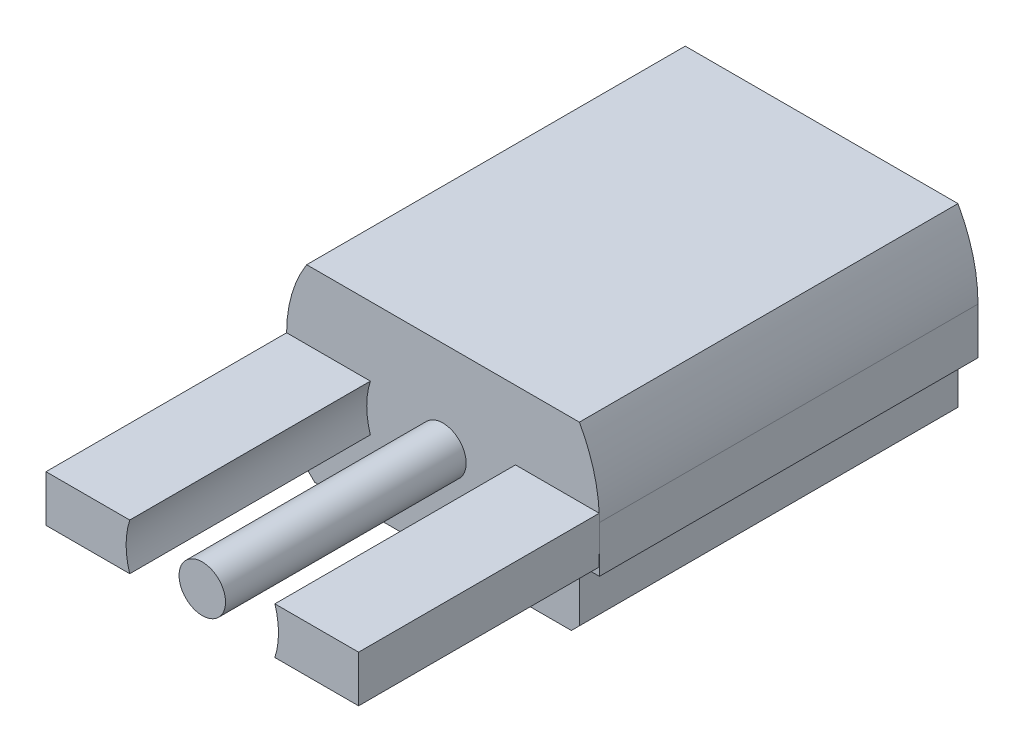
ISO-10303-21;
HEADER;
FILE_DESCRIPTION(('STEP AP214'),'2;1');
FILE_NAME('part.step','',(''),(''),'','','');
FILE_SCHEMA(('AUTOMOTIVE_DESIGN { 1 0 10303 214 1 1 1 1 }'));
ENDSEC;
DATA;
#1=APPLICATION_CONTEXT('core data for automotive mechanical design processes');
#2=APPLICATION_PROTOCOL_DEFINITION('international standard','automotive_design',2000,#1);
#3=PRODUCT_CONTEXT('',#1,'mechanical');
#4=PRODUCT('Part','Part','',(#3));
#5=PRODUCT_RELATED_PRODUCT_CATEGORY('part','',(#4));
#6=PRODUCT_DEFINITION_FORMATION('','',#4);
#7=PRODUCT_DEFINITION_CONTEXT('part definition',#1,'design');
#8=PRODUCT_DEFINITION('design','',#6,#7);
#9=PRODUCT_DEFINITION_SHAPE('','',#8);
#10=(LENGTH_UNIT() NAMED_UNIT(*) SI_UNIT(.MILLI.,.METRE.));
#11=(NAMED_UNIT(*) PLANE_ANGLE_UNIT() SI_UNIT($,.RADIAN.));
#12=(NAMED_UNIT(*) SI_UNIT($,.STERADIAN.) SOLID_ANGLE_UNIT());
#13=UNCERTAINTY_MEASURE_WITH_UNIT(LENGTH_MEASURE(1.E-05),#10,'distance_accuracy_value','');
#14=(GEOMETRIC_REPRESENTATION_CONTEXT(3) GLOBAL_UNCERTAINTY_ASSIGNED_CONTEXT((#13)) GLOBAL_UNIT_ASSIGNED_CONTEXT((#10,
#11,#12)) REPRESENTATION_CONTEXT('',''));
#15=CARTESIAN_POINT('',(0.,0.,0.));
#16=DIRECTION('',(0.,0.,1.));
#17=DIRECTION('',(1.,0.,0.));
#18=AXIS2_PLACEMENT_3D('',#15,#16,#17);
#19=CARTESIAN_POINT('',(-0.25,1.44,4.72));
#20=DIRECTION('',(0.,1.,0.));
#21=DIRECTION('',(-1.,0.,0.));
#22=AXIS2_PLACEMENT_3D('',#19,#20,#21);
#23=PLANE('',#22);
#24=DIRECTION('',(0.,0.,1.));
#25=VECTOR('',#24,1.);
#26=CARTESIAN_POINT('',(-0.25,1.44,0.));
#27=LINE('',#26,#25);
#28=CARTESIAN_POINT('',(-0.25,1.44,7.72));
#29=VERTEX_POINT('',#28);
#30=CARTESIAN_POINT('',(-0.25,1.44,4.72));
#31=VERTEX_POINT('',#30);
#32=EDGE_CURVE('E277',#29,#31,#27,.F.);
#33=ORIENTED_EDGE('',*,*,#32,.F.);
#34=DIRECTION('',(1.,0.,0.));
#35=VECTOR('',#34,1.);
#36=CARTESIAN_POINT('',(1.69872085735134,1.44,7.72));
#37=LINE('',#36,#35);
#38=CARTESIAN_POINT('',(0.794066227119449,1.44,7.72));
#39=VERTEX_POINT('',#38);
#40=EDGE_CURVE('E155',#39,#29,#37,.F.);
#41=ORIENTED_EDGE('',*,*,#40,.F.);
#42=DIRECTION('',(0.,0.,-1.));
#43=VECTOR('',#42,1.);
#44=CARTESIAN_POINT('',(0.794066227119449,1.44,7.72));
#45=LINE('',#44,#43);
#46=CARTESIAN_POINT('',(0.794066227119449,1.44,4.72));
#47=VERTEX_POINT('',#46);
#48=EDGE_CURVE('E136',#39,#47,#45,.T.);
#49=ORIENTED_EDGE('',*,*,#48,.T.);
#50=DIRECTION('',(-1.,0.,0.));
#51=VECTOR('',#50,1.);
#52=CARTESIAN_POINT('',(-0.25,1.44,4.72));
#53=LINE('',#52,#51);
#54=EDGE_CURVE('E20',#47,#31,#53,.T.);
#55=ORIENTED_EDGE('',*,*,#54,.T.);
#56=EDGE_LOOP('',(#33,#41,#49,#55));
#57=FACE_BOUND('',#56,.T.);
#58=ADVANCED_FACE('F16',(#57),#23,.T.);
#59=CARTESIAN_POINT('',(3.64744171470268,1.44,4.72));
#60=DIRECTION('',(1.,0.,0.));
#61=DIRECTION('',(0.,1.,0.));
#62=AXIS2_PLACEMENT_3D('',#59,#60,#61);
#63=PLANE('',#62);
#64=DIRECTION('',(0.,1.,0.));
#65=VECTOR('',#64,1.);
#66=CARTESIAN_POINT('',(3.64744171470268,1.44,4.72));
#67=LINE('',#66,#65);
#68=CARTESIAN_POINT('',(3.64744171470268,0.86,4.72));
#69=VERTEX_POINT('',#68);
#70=CARTESIAN_POINT('',(3.64872085735134,1.33964643827846,4.72));
#71=VERTEX_POINT('',#70);
#72=EDGE_CURVE('E152',#69,#71,#67,.T.);
#73=ORIENTED_EDGE('',*,*,#72,.T.);
#74=CARTESIAN_POINT('',(1.68044207297751,1.33964643827846,4.72));
#75=DIRECTION('',(0.,0.,-1.));
#76=DIRECTION('',(0.998701086542201,0.0509523281060592,0.));
#77=AXIS2_PLACEMENT_3D('',#74,#75,#76);
#78=CIRCLE('',#77,1.96955792702249);
#79=CARTESIAN_POINT('',(3.64744171470268,1.44,4.72));
#80=VERTEX_POINT('',#79);
#81=EDGE_CURVE('E169',#80,#71,#78,.T.);
#82=ORIENTED_EDGE('',*,*,#81,.F.);
#83=DIRECTION('',(0.,0.,1.));
#84=VECTOR('',#83,1.);
#85=CARTESIAN_POINT('',(3.64744171470268,1.44,4.72));
#86=LINE('',#85,#84);
#87=CARTESIAN_POINT('',(3.64744171470268,1.44,7.72));
#88=VERTEX_POINT('',#87);
#89=EDGE_CURVE('E283',#88,#80,#86,.F.);
#90=ORIENTED_EDGE('',*,*,#89,.F.);
#91=DIRECTION('',(0.,-1.,0.));
#92=VECTOR('',#91,1.);
#93=CARTESIAN_POINT('',(3.64744171470268,1.15,7.72));
#94=LINE('',#93,#92);
#95=CARTESIAN_POINT('',(3.64744171470268,0.86,7.72));
#96=VERTEX_POINT('',#95);
#97=EDGE_CURVE('E289',#96,#88,#94,.F.);
#98=ORIENTED_EDGE('',*,*,#97,.F.);
#99=DIRECTION('',(0.,0.,-1.));
#100=VECTOR('',#99,1.);
#101=CARTESIAN_POINT('',(3.64744171470268,0.86,0.));
#102=LINE('',#101,#100);
#103=EDGE_CURVE('E296',#69,#96,#102,.F.);
#104=ORIENTED_EDGE('',*,*,#103,.F.);
#105=EDGE_LOOP('',(#73,#82,#90,#98,#104));
#106=FACE_BOUND('',#105,.T.);
#107=ADVANCED_FACE('F176',(#106),#63,.T.);
#108=CARTESIAN_POINT('',(3.65,1.33964643827846,0.));
#109=DIRECTION('',(1.,0.,0.));
#110=DIRECTION('',(0.,0.,-1.));
#111=AXIS2_PLACEMENT_3D('',#108,#109,#110);
#112=PLANE('',#111);
#113=DIRECTION('',(0.,1.,0.));
#114=VECTOR('',#113,1.);
#115=CARTESIAN_POINT('',(3.65,1.33964643827846,0.));
#116=LINE('',#115,#114);
#117=CARTESIAN_POINT('',(3.65,0.759646438278462,0.));
#118=VERTEX_POINT('',#117);
#119=CARTESIAN_POINT('',(3.65,1.33964643827846,0.));
#120=VERTEX_POINT('',#119);
#121=EDGE_CURVE('E141',#118,#120,#116,.T.);
#122=ORIENTED_EDGE('',*,*,#121,.T.);
#123=DIRECTION('',(0.,0.,1.));
#124=VECTOR('',#123,1.);
#125=CARTESIAN_POINT('',(3.65,1.33964643827846,0.));
#126=LINE('',#125,#124);
#127=EDGE_CURVE('E343',#71,#120,#126,.F.);
#128=ORIENTED_EDGE('',*,*,#127,.F.);
#129=DIRECTION('',(0.,1.,0.));
#130=VECTOR('',#129,1.);
#131=CARTESIAN_POINT('',(3.65,1.33964643827846,4.72));
#132=LINE('',#131,#130);
#133=CARTESIAN_POINT('',(3.65,0.759646438278462,4.72));
#134=VERTEX_POINT('',#133);
#135=EDGE_CURVE('E348',#71,#134,#132,.F.);
#136=ORIENTED_EDGE('',*,*,#135,.T.);
#137=DIRECTION('',(0.,0.,-1.));
#138=VECTOR('',#137,1.);
#139=CARTESIAN_POINT('',(3.65,0.759646438278462,0.));
#140=LINE('',#139,#138);
#141=EDGE_CURVE('E293',#118,#134,#140,.F.);
#142=ORIENTED_EDGE('',*,*,#141,.F.);
#143=EDGE_LOOP('',(#122,#128,#136,#142));
#144=FACE_BOUND('',#143,.T.);
#145=ADVANCED_FACE('F185',(#144),#112,.T.);
#146=CARTESIAN_POINT('',(1.69872085735134,1.15,7.72));
#147=DIRECTION('',(0.,0.,-1.));
#148=DIRECTION('',(-1.,0.,0.));
#149=AXIS2_PLACEMENT_3D('',#146,#147,#148);
#150=CYLINDRICAL_SURFACE('',#149,0.95);
#151=CARTESIAN_POINT('',(1.69872085735134,1.15,7.72));
#152=DIRECTION('',(0.,0.,-1.));
#153=DIRECTION('',(-1.,0.,0.));
#154=AXIS2_PLACEMENT_3D('',#151,#152,#153);
#155=CIRCLE('',#154,0.95);
#156=CARTESIAN_POINT('',(0.794066227119448,0.86,7.72));
#157=VERTEX_POINT('',#156);
#158=EDGE_CURVE('E156',#157,#39,#155,.T.);
#159=ORIENTED_EDGE('',*,*,#158,.F.);
#160=DIRECTION('',(0.,0.,-1.));
#161=VECTOR('',#160,1.);
#162=CARTESIAN_POINT('',(0.794066227119447,0.86,0.));
#163=LINE('',#162,#161);
#164=CARTESIAN_POINT('',(0.794066227119448,0.86,4.72));
#165=VERTEX_POINT('',#164);
#166=EDGE_CURVE('E138',#165,#157,#163,.F.);
#167=ORIENTED_EDGE('',*,*,#166,.F.);
#168=CARTESIAN_POINT('',(1.69872085735134,1.15,4.72));
#169=DIRECTION('',(0.,0.,-1.));
#170=DIRECTION('',(-1.,0.,0.));
#171=AXIS2_PLACEMENT_3D('',#168,#169,#170);
#172=CIRCLE('',#171,0.95);
#173=EDGE_CURVE('E131',#47,#165,#172,.F.);
#174=ORIENTED_EDGE('',*,*,#173,.F.);
#175=ORIENTED_EDGE('',*,*,#48,.F.);
#176=EDGE_LOOP('',(#159,#167,#174,#175));
#177=FACE_BOUND('',#176,.T.);
#178=ADVANCED_FACE('F134',(#177),#150,.F.);
#179=CARTESIAN_POINT('',(1.69872085735134,1.15,7.72));
#180=DIRECTION('',(0.,0.,1.));
#181=DIRECTION('',(0.,-1.,0.));
#182=AXIS2_PLACEMENT_3D('',#179,#180,#181);
#183=PLANE('',#182);
#184=DIRECTION('',(0.,-1.,0.));
#185=VECTOR('',#184,1.);
#186=CARTESIAN_POINT('',(-0.25,0.86,7.72));
#187=LINE('',#186,#185);
#188=CARTESIAN_POINT('',(-0.25,0.86,7.72));
#189=VERTEX_POINT('',#188);
#190=EDGE_CURVE('E280',#189,#29,#187,.F.);
#191=ORIENTED_EDGE('',*,*,#190,.F.);
#192=DIRECTION('',(1.,0.,0.));
#193=VECTOR('',#192,1.);
#194=CARTESIAN_POINT('',(0.,0.86,7.72));
#195=LINE('',#194,#193);
#196=EDGE_CURVE('E319',#157,#189,#195,.F.);
#197=ORIENTED_EDGE('',*,*,#196,.F.);
#198=ORIENTED_EDGE('',*,*,#158,.T.);
#199=ORIENTED_EDGE('',*,*,#40,.T.);
#200=EDGE_LOOP('',(#191,#197,#198,#199));
#201=FACE_BOUND('',#200,.T.);
#202=ADVANCED_FACE('F474',(#201),#183,.T.);
#203=CARTESIAN_POINT('',(-0.25,0.86,0.));
#204=DIRECTION('',(-1.,0.,0.));
#205=DIRECTION('',(0.,-1.,0.));
#206=AXIS2_PLACEMENT_3D('',#203,#204,#205);
#207=PLANE('',#206);
#208=ORIENTED_EDGE('',*,*,#190,.T.);
#209=ORIENTED_EDGE('',*,*,#32,.T.);
#210=DIRECTION('',(0.,0.,1.));
#211=VECTOR('',#210,1.);
#212=CARTESIAN_POINT('',(-0.25,1.44,0.));
#213=LINE('',#212,#211);
#214=CARTESIAN_POINT('',(-0.25,1.44,0.));
#215=VERTEX_POINT('',#214);
#216=EDGE_CURVE('E267',#215,#31,#213,.T.);
#217=ORIENTED_EDGE('',*,*,#216,.F.);
#218=DIRECTION('',(0.,-1.,0.));
#219=VECTOR('',#218,1.);
#220=CARTESIAN_POINT('',(-0.25,0.86,0.));
#221=LINE('',#220,#219);
#222=CARTESIAN_POINT('',(-0.25,0.86,0.));
#223=VERTEX_POINT('',#222);
#224=EDGE_CURVE('E327',#215,#223,#221,.T.);
#225=ORIENTED_EDGE('',*,*,#224,.T.);
#226=DIRECTION('',(0.,0.,-1.));
#227=VECTOR('',#226,1.);
#228=CARTESIAN_POINT('',(-0.25,0.86,0.));
#229=LINE('',#228,#227);
#230=EDGE_CURVE('E321',#189,#223,#229,.T.);
#231=ORIENTED_EDGE('',*,*,#230,.F.);
#232=EDGE_LOOP('',(#208,#209,#217,#225,#231));
#233=FACE_BOUND('',#232,.T.);
#234=ADVANCED_FACE('F478',(#233),#207,.T.);
#235=CARTESIAN_POINT('',(3.65,0.759646438278462,0.));
#236=DIRECTION('',(0.,-1.,0.));
#237=DIRECTION('',(0.,0.,-1.));
#238=AXIS2_PLACEMENT_3D('',#235,#236,#237);
#239=PLANE('',#238);
#240=DIRECTION('',(1.,0.,0.));
#241=VECTOR('',#240,1.);
#242=CARTESIAN_POINT('',(3.65,0.759646438278462,0.));
#243=LINE('',#242,#241);
#244=CARTESIAN_POINT('',(3.4,0.759646438278462,0.));
#245=VERTEX_POINT('',#244);
#246=EDGE_CURVE('E302',#245,#118,#243,.T.);
#247=ORIENTED_EDGE('',*,*,#246,.T.);
#248=ORIENTED_EDGE('',*,*,#141,.T.);
#249=DIRECTION('',(1.,0.,0.));
#250=VECTOR('',#249,1.);
#251=CARTESIAN_POINT('',(3.65,0.759646438278462,4.72));
#252=LINE('',#251,#250);
#253=CARTESIAN_POINT('',(3.4,0.759646438278462,4.72));
#254=VERTEX_POINT('',#253);
#255=EDGE_CURVE('E279',#134,#254,#252,.F.);
#256=ORIENTED_EDGE('',*,*,#255,.T.);
#257=DIRECTION('',(0.,0.,-1.));
#258=VECTOR('',#257,1.);
#259=CARTESIAN_POINT('',(3.4,0.759646438278462,0.));
#260=LINE('',#259,#258);
#261=EDGE_CURVE('E372',#245,#254,#260,.F.);
#262=ORIENTED_EDGE('',*,*,#261,.F.);
#263=EDGE_LOOP('',(#247,#248,#256,#262));
#264=FACE_BOUND('',#263,.T.);
#265=ADVANCED_FACE('F613',(#264),#239,.T.);
#266=CARTESIAN_POINT('',(1.69872085735134,1.15,7.72));
#267=DIRECTION('',(0.,0.,-1.));
#268=DIRECTION('',(-1.,0.,0.));
#269=AXIS2_PLACEMENT_3D('',#266,#267,#268);
#270=PLANE('',#269);
#271=CARTESIAN_POINT('',(1.69872085735134,1.15,7.72));
#272=DIRECTION('',(0.,0.,1.));
#273=DIRECTION('',(1.,0.,0.));
#274=AXIS2_PLACEMENT_3D('',#271,#272,#273);
#275=CIRCLE('',#274,0.29);
#276=CARTESIAN_POINT('',(1.98872085735134,1.15,7.72));
#277=VERTEX_POINT('',#276);
#278=EDGE_CURVE('E375',#277,#277,#275,.F.);
#279=ORIENTED_EDGE('',*,*,#278,.F.);
#280=EDGE_LOOP('',(#279));
#281=FACE_BOUND('',#280,.T.);
#282=ADVANCED_FACE('F616',(#281),#270,.F.);
#283=CARTESIAN_POINT('',(1.69872085735134,1.15,7.72));
#284=DIRECTION('',(0.,0.,1.));
#285=DIRECTION('',(0.,-1.,0.));
#286=AXIS2_PLACEMENT_3D('',#283,#284,#285);
#287=PLANE('',#286);
#288=ORIENTED_EDGE('',*,*,#97,.T.);
#289=DIRECTION('',(-1.,0.,0.));
#290=VECTOR('',#289,1.);
#291=CARTESIAN_POINT('',(-0.25,1.44,7.72));
#292=LINE('',#291,#290);
#293=CARTESIAN_POINT('',(2.60337548758323,1.44,7.72));
#294=VERTEX_POINT('',#293);
#295=EDGE_CURVE('E286',#294,#88,#292,.F.);
#296=ORIENTED_EDGE('',*,*,#295,.F.);
#297=CARTESIAN_POINT('',(1.69872085735134,1.15,7.72));
#298=DIRECTION('',(0.,0.,-1.));
#299=DIRECTION('',(-1.,0.,0.));
#300=AXIS2_PLACEMENT_3D('',#297,#298,#299);
#301=CIRCLE('',#300,0.95);
#302=CARTESIAN_POINT('',(2.60337548758323,0.86,7.72));
#303=VERTEX_POINT('',#302);
#304=EDGE_CURVE('E228',#294,#303,#301,.T.);
#305=ORIENTED_EDGE('',*,*,#304,.T.);
#306=DIRECTION('',(1.,0.,0.));
#307=VECTOR('',#306,1.);
#308=CARTESIAN_POINT('',(0.,0.86,7.72));
#309=LINE('',#308,#307);
#310=EDGE_CURVE('E299',#96,#303,#309,.F.);
#311=ORIENTED_EDGE('',*,*,#310,.F.);
#312=EDGE_LOOP('',(#288,#296,#305,#311));
#313=FACE_BOUND('',#312,.T.);
#314=ADVANCED_FACE('F461',(#313),#287,.T.);
#315=CARTESIAN_POINT('',(0.,0.86,0.));
#316=DIRECTION('',(0.,-1.,0.));
#317=DIRECTION('',(0.,0.,-1.));
#318=AXIS2_PLACEMENT_3D('',#315,#316,#317);
#319=PLANE('',#318);
#320=ORIENTED_EDGE('',*,*,#103,.T.);
#321=ORIENTED_EDGE('',*,*,#310,.T.);
#322=DIRECTION('',(0.,0.,-1.));
#323=VECTOR('',#322,1.);
#324=CARTESIAN_POINT('',(2.60337548758323,0.86,7.72));
#325=LINE('',#324,#323);
#326=CARTESIAN_POINT('',(2.60337548758323,0.86,4.72));
#327=VERTEX_POINT('',#326);
#328=EDGE_CURVE('E380',#303,#327,#325,.T.);
#329=ORIENTED_EDGE('',*,*,#328,.T.);
#330=DIRECTION('',(1.,0.,0.));
#331=VECTOR('',#330,1.);
#332=CARTESIAN_POINT('',(0.,0.86,4.72));
#333=LINE('',#332,#331);
#334=EDGE_CURVE('E292',#327,#69,#333,.T.);
#335=ORIENTED_EDGE('',*,*,#334,.T.);
#336=EDGE_LOOP('',(#320,#321,#329,#335));
#337=FACE_BOUND('',#336,.T.);
#338=ADVANCED_FACE('F622',(#337),#319,.T.);
#339=CARTESIAN_POINT('',(-0.25,1.44,4.72));
#340=DIRECTION('',(0.,1.,0.));
#341=DIRECTION('',(-1.,0.,0.));
#342=AXIS2_PLACEMENT_3D('',#339,#340,#341);
#343=PLANE('',#342);
#344=ORIENTED_EDGE('',*,*,#89,.T.);
#345=DIRECTION('',(-1.,0.,0.));
#346=VECTOR('',#345,1.);
#347=CARTESIAN_POINT('',(-0.25,1.44,4.72));
#348=LINE('',#347,#346);
#349=CARTESIAN_POINT('',(2.60337548758323,1.44,4.72));
#350=VERTEX_POINT('',#349);
#351=EDGE_CURVE('E285',#80,#350,#348,.T.);
#352=ORIENTED_EDGE('',*,*,#351,.T.);
#353=DIRECTION('',(0.,0.,-1.));
#354=VECTOR('',#353,1.);
#355=CARTESIAN_POINT('',(2.60337548758323,1.44,7.72));
#356=LINE('',#355,#354);
#357=EDGE_CURVE('E225',#350,#294,#356,.F.);
#358=ORIENTED_EDGE('',*,*,#357,.T.);
#359=ORIENTED_EDGE('',*,*,#295,.T.);
#360=EDGE_LOOP('',(#344,#352,#358,#359));
#361=FACE_BOUND('',#360,.T.);
#362=ADVANCED_FACE('F456',(#361),#343,.T.);
#363=CARTESIAN_POINT('',(1.3542,1.44,0.));
#364=DIRECTION('',(0.,0.,1.));
#365=DIRECTION('',(1.,0.,0.));
#366=AXIS2_PLACEMENT_3D('',#363,#364,#365);
#367=CYLINDRICAL_SURFACE('',#366,1.6042);
#368=CARTESIAN_POINT('',(1.3542,1.44,0.));
#369=DIRECTION('',(0.,0.,1.));
#370=DIRECTION('',(1.,0.,0.));
#371=AXIS2_PLACEMENT_3D('',#368,#369,#370);
#372=CIRCLE('',#371,1.6042);
#373=CARTESIAN_POINT('',(0.,2.3,0.));
#374=VERTEX_POINT('',#373);
#375=EDGE_CURVE('E276',#374,#215,#372,.T.);
#376=ORIENTED_EDGE('',*,*,#375,.T.);
#377=ORIENTED_EDGE('',*,*,#216,.T.);
#378=CARTESIAN_POINT('',(1.3542,1.44,4.72));
#379=DIRECTION('',(0.,0.,1.));
#380=DIRECTION('',(1.,0.,0.));
#381=AXIS2_PLACEMENT_3D('',#378,#379,#380);
#382=CIRCLE('',#381,1.6042);
#383=CARTESIAN_POINT('',(0.,2.3,4.72));
#384=VERTEX_POINT('',#383);
#385=EDGE_CURVE('E148',#31,#384,#382,.F.);
#386=ORIENTED_EDGE('',*,*,#385,.T.);
#387=DIRECTION('',(0.,0.,1.));
#388=VECTOR('',#387,1.);
#389=CARTESIAN_POINT('',(0.,2.3,0.));
#390=LINE('',#389,#388);
#391=EDGE_CURVE('E400',#374,#384,#390,.T.);
#392=ORIENTED_EDGE('',*,*,#391,.F.);
#393=EDGE_LOOP('',(#376,#377,#386,#392));
#394=FACE_BOUND('',#393,.T.);
#395=ADVANCED_FACE('F258',(#394),#367,.T.);
#396=CARTESIAN_POINT('',(1.68044207297751,1.33964643827846,0.));
#397=DIRECTION('',(0.,0.,1.));
#398=DIRECTION('',(1.,0.,0.));
#399=AXIS2_PLACEMENT_3D('',#396,#397,#398);
#400=CYLINDRICAL_SURFACE('',#399,1.96955792702249);
#401=CARTESIAN_POINT('',(1.68044207297751,1.33964643827846,0.));
#402=DIRECTION('',(0.,0.,1.));
#403=DIRECTION('',(1.,0.,0.));
#404=AXIS2_PLACEMENT_3D('',#401,#402,#403);
#405=CIRCLE('',#404,1.96955792702249);
#406=CARTESIAN_POINT('',(3.4,2.3,0.));
#407=VERTEX_POINT('',#406);
#408=EDGE_CURVE('E320',#120,#407,#405,.T.);
#409=ORIENTED_EDGE('',*,*,#408,.T.);
#410=DIRECTION('',(0.,0.,1.));
#411=VECTOR('',#410,1.);
#412=CARTESIAN_POINT('',(3.4,2.3,0.));
#413=LINE('',#412,#411);
#414=CARTESIAN_POINT('',(3.4,2.3,4.72));
#415=VERTEX_POINT('',#414);
#416=EDGE_CURVE('E398',#415,#407,#413,.F.);
#417=ORIENTED_EDGE('',*,*,#416,.F.);
#418=CARTESIAN_POINT('',(1.68044207297751,1.33964643827846,4.72));
#419=DIRECTION('',(0.,0.,1.));
#420=DIRECTION('',(1.,0.,0.));
#421=AXIS2_PLACEMENT_3D('',#418,#419,#420);
#422=CIRCLE('',#421,1.96955792702249);
#423=EDGE_CURVE('E275',#415,#80,#422,.F.);
#424=ORIENTED_EDGE('',*,*,#423,.T.);
#425=ORIENTED_EDGE('',*,*,#81,.T.);
#426=ORIENTED_EDGE('',*,*,#127,.T.);
#427=EDGE_LOOP('',(#409,#417,#424,#425,#426));
#428=FACE_BOUND('',#427,.T.);
#429=ADVANCED_FACE('F253',(#428),#400,.T.);
#430=CARTESIAN_POINT('',(0.,0.86,0.));
#431=DIRECTION('',(0.,-1.,0.));
#432=DIRECTION('',(0.,0.,-1.));
#433=AXIS2_PLACEMENT_3D('',#430,#431,#432);
#434=PLANE('',#433);
#435=DIRECTION('',(0.,0.,1.));
#436=VECTOR('',#435,1.);
#437=CARTESIAN_POINT('',(0.,0.86,0.));
#438=LINE('',#437,#436);
#439=CARTESIAN_POINT('',(0.,0.86,4.72));
#440=VERTEX_POINT('',#439);
#441=CARTESIAN_POINT('',(0.,0.86,0.));
#442=VERTEX_POINT('',#441);
#443=EDGE_CURVE('E397',#440,#442,#438,.F.);
#444=ORIENTED_EDGE('',*,*,#443,.F.);
#445=DIRECTION('',(1.,0.,0.));
#446=VECTOR('',#445,1.);
#447=CARTESIAN_POINT('',(0.,0.86,4.72));
#448=LINE('',#447,#446);
#449=EDGE_CURVE('E370',#440,#165,#448,.T.);
#450=ORIENTED_EDGE('',*,*,#449,.T.);
#451=ORIENTED_EDGE('',*,*,#166,.T.);
#452=ORIENTED_EDGE('',*,*,#196,.T.);
#453=ORIENTED_EDGE('',*,*,#230,.T.);
#454=DIRECTION('',(1.,0.,0.));
#455=VECTOR('',#454,1.);
#456=CARTESIAN_POINT('',(0.,0.86,0.));
#457=LINE('',#456,#455);
#458=EDGE_CURVE('E324',#223,#442,#457,.T.);
#459=ORIENTED_EDGE('',*,*,#458,.T.);
#460=EDGE_LOOP('',(#444,#450,#451,#452,#453,#459));
#461=FACE_BOUND('',#460,.T.);
#462=ADVANCED_FACE('F249',(#461),#434,.T.);
#463=CARTESIAN_POINT('',(3.4,0.759646438278462,0.));
#464=DIRECTION('',(1.,0.,0.));
#465=DIRECTION('',(0.,0.,-1.));
#466=AXIS2_PLACEMENT_3D('',#463,#464,#465);
#467=PLANE('',#466);
#468=DIRECTION('',(0.,0.,1.));
#469=VECTOR('',#468,1.);
#470=CARTESIAN_POINT('',(3.4,0.1,0.));
#471=LINE('',#470,#469);
#472=CARTESIAN_POINT('',(3.4,0.1,0.));
#473=VERTEX_POINT('',#472);
#474=CARTESIAN_POINT('',(3.4,0.1,4.72));
#475=VERTEX_POINT('',#474);
#476=EDGE_CURVE('E430',#473,#475,#471,.T.);
#477=ORIENTED_EDGE('',*,*,#476,.F.);
#478=DIRECTION('',(0.,1.,0.));
#479=VECTOR('',#478,1.);
#480=CARTESIAN_POINT('',(3.4,0.759646438278462,0.));
#481=LINE('',#480,#479);
#482=EDGE_CURVE('E374',#473,#245,#481,.T.);
#483=ORIENTED_EDGE('',*,*,#482,.T.);
#484=ORIENTED_EDGE('',*,*,#261,.T.);
#485=DIRECTION('',(0.,1.,0.));
#486=VECTOR('',#485,1.);
#487=CARTESIAN_POINT('',(3.4,0.759646438278462,4.72));
#488=LINE('',#487,#486);
#489=EDGE_CURVE('E373',#254,#475,#488,.F.);
#490=ORIENTED_EDGE('',*,*,#489,.T.);
#491=EDGE_LOOP('',(#477,#483,#484,#490));
#492=FACE_BOUND('',#491,.T.);
#493=ADVANCED_FACE('F245',(#492),#467,.T.);
#494=CARTESIAN_POINT('',(1.69872085735134,1.15,4.72));
#495=DIRECTION('',(0.,0.,1.));
#496=DIRECTION('',(1.,0.,0.));
#497=AXIS2_PLACEMENT_3D('',#494,#495,#496);
#498=CYLINDRICAL_SURFACE('',#497,0.29);
#499=CARTESIAN_POINT('',(1.69872085735134,1.15,4.72));
#500=DIRECTION('',(0.,0.,1.));
#501=DIRECTION('',(1.,0.,0.));
#502=AXIS2_PLACEMENT_3D('',#499,#500,#501);
#503=CIRCLE('',#502,0.29);
#504=CARTESIAN_POINT('',(1.98872085735134,1.15,4.72));
#505=VERTEX_POINT('',#504);
#506=EDGE_CURVE('E226',#505,#505,#503,.F.);
#507=ORIENTED_EDGE('',*,*,#506,.F.);
#508=EDGE_LOOP('',(#507));
#509=FACE_BOUND('',#508,.T.);
#510=ORIENTED_EDGE('',*,*,#278,.T.);
#511=EDGE_LOOP('',(#510));
#512=FACE_BOUND('',#511,.T.);
#513=ADVANCED_FACE('F241',(#509,#512),#498,.T.);
#514=CARTESIAN_POINT('',(1.69872085735134,1.15,7.72));
#515=DIRECTION('',(0.,0.,-1.));
#516=DIRECTION('',(-1.,0.,0.));
#517=AXIS2_PLACEMENT_3D('',#514,#515,#516);
#518=CYLINDRICAL_SURFACE('',#517,0.95);
#519=CARTESIAN_POINT('',(1.69872085735134,1.15,4.72));
#520=DIRECTION('',(0.,0.,-1.));
#521=DIRECTION('',(-1.,0.,0.));
#522=AXIS2_PLACEMENT_3D('',#519,#520,#521);
#523=CIRCLE('',#522,0.95);
#524=EDGE_CURVE('E425',#327,#350,#523,.F.);
#525=ORIENTED_EDGE('',*,*,#524,.F.);
#526=ORIENTED_EDGE('',*,*,#328,.F.);
#527=ORIENTED_EDGE('',*,*,#304,.F.);
#528=ORIENTED_EDGE('',*,*,#357,.F.);
#529=EDGE_LOOP('',(#525,#526,#527,#528));
#530=FACE_BOUND('',#529,.T.);
#531=ADVANCED_FACE('F236',(#530),#518,.F.);
#532=CARTESIAN_POINT('',(0.,2.3,0.));
#533=DIRECTION('',(0.,1.,0.));
#534=DIRECTION('',(0.,0.,1.));
#535=AXIS2_PLACEMENT_3D('',#532,#533,#534);
#536=PLANE('',#535);
#537=ORIENTED_EDGE('',*,*,#416,.T.);
#538=DIRECTION('',(1.,0.,0.));
#539=VECTOR('',#538,1.);
#540=CARTESIAN_POINT('',(0.,2.3,0.));
#541=LINE('',#540,#539);
#542=CARTESIAN_POINT('',(1.72046800371794,2.3,0.));
#543=VERTEX_POINT('',#542);
#544=EDGE_CURVE('E395',#407,#543,#541,.F.);
#545=ORIENTED_EDGE('',*,*,#544,.T.);
#546=CARTESIAN_POINT('',(1.72046800217332,2.29999999999966,2.73487765676882E-11));
#547=CARTESIAN_POINT('',(1.71364533478221,2.29999999999983,0.000121422039165599));
#548=CARTESIAN_POINT('',(1.70682266739111,2.29999999999994,0.000182133045085545));
#549=CARTESIAN_POINT('',(1.69317733260889,2.30000000000006,0.000182133045131684));
#550=CARTESIAN_POINT('',(1.68635466521779,2.30000000000006,0.000121422039257882));
#551=CARTESIAN_POINT('',(1.67953199782668,2.3,2.74872088262984E-11));
#552=B_SPLINE_CURVE_WITH_KNOTS('',3,(#546,#547,#548,#549,#550,#551),.UNSPECIFIED.,.F.,.F.,(4,2,
4),(0.,0.0204688125059364,0.0409376250118718),.UNSPECIFIED.);
#553=CARTESIAN_POINT('',(1.67953199705436,2.3,1.37435639913866E-11));
#554=VERTEX_POINT('',#553);
#555=EDGE_CURVE('E216',#543,#554,#552,.T.);
#556=ORIENTED_EDGE('',*,*,#555,.T.);
#557=DIRECTION('',(1.,0.,0.));
#558=VECTOR('',#557,1.);
#559=CARTESIAN_POINT('',(0.,2.3,0.));
#560=LINE('',#559,#558);
#561=EDGE_CURVE('E224',#554,#374,#560,.F.);
#562=ORIENTED_EDGE('',*,*,#561,.T.);
#563=ORIENTED_EDGE('',*,*,#391,.T.);
#564=DIRECTION('',(1.,0.,0.));
#565=VECTOR('',#564,1.);
#566=CARTESIAN_POINT('',(3.525,2.3,4.72));
#567=LINE('',#566,#565);
#568=EDGE_CURVE('E422',#415,#384,#567,.F.);
#569=ORIENTED_EDGE('',*,*,#568,.F.);
#570=EDGE_LOOP('',(#537,#545,#556,#562,#563,#569));
#571=FACE_BOUND('',#570,.T.);
#572=ADVANCED_FACE('F230',(#571),#536,.T.);
#573=CARTESIAN_POINT('',(0.,0.86,0.));
#574=DIRECTION('',(-1.,0.,0.));
#575=DIRECTION('',(0.,0.,1.));
#576=AXIS2_PLACEMENT_3D('',#573,#574,#575);
#577=PLANE('',#576);
#578=DIRECTION('',(0.,0.,1.));
#579=VECTOR('',#578,1.);
#580=CARTESIAN_POINT('',(0.,0.1,0.));
#581=LINE('',#580,#579);
#582=CARTESIAN_POINT('',(0.,0.1,4.72));
#583=VERTEX_POINT('',#582);
#584=CARTESIAN_POINT('',(0.,0.1,0.));
#585=VERTEX_POINT('',#584);
#586=EDGE_CURVE('E421',#583,#585,#581,.F.);
#587=ORIENTED_EDGE('',*,*,#586,.F.);
#588=DIRECTION('',(0.,1.,0.));
#589=VECTOR('',#588,1.);
#590=CARTESIAN_POINT('',(0.,1.04964643827846,4.72));
#591=LINE('',#590,#589);
#592=EDGE_CURVE('E418',#440,#583,#591,.F.);
#593=ORIENTED_EDGE('',*,*,#592,.F.);
#594=ORIENTED_EDGE('',*,*,#443,.T.);
#595=DIRECTION('',(0.,1.,0.));
#596=VECTOR('',#595,1.);
#597=CARTESIAN_POINT('',(0.,0.86,0.));
#598=LINE('',#597,#596);
#599=EDGE_CURVE('E435',#442,#585,#598,.F.);
#600=ORIENTED_EDGE('',*,*,#599,.T.);
#601=EDGE_LOOP('',(#587,#593,#594,#600));
#602=FACE_BOUND('',#601,.T.);
#603=ADVANCED_FACE('F235',(#602),#577,.T.);
#604=CARTESIAN_POINT('',(3.525,1.04964643827846,0.));
#605=DIRECTION('',(0.,0.,1.));
#606=DIRECTION('',(1.,0.,0.));
#607=AXIS2_PLACEMENT_3D('',#604,#605,#606);
#608=PLANE('',#607);
#609=CARTESIAN_POINT('',(1.79,1.15,0.));
#610=CARTESIAN_POINT('',(1.79,1.18677657490272,0.));
#611=CARTESIAN_POINT('',(1.76363961030679,1.21363961030679,0.));
#612=CARTESIAN_POINT('',(1.73807464757624,1.23969205137185,0.));
#613=CARTESIAN_POINT('',(1.7,1.24,0.));
#614=CARTESIAN_POINT('',(1.6635240687424,1.24029501817368,0.));
#615=CARTESIAN_POINT('',(1.63636038969321,1.21363961030679,0.));
#616=CARTESIAN_POINT('',(1.61,1.18777246110619,0.));
#617=CARTESIAN_POINT('',(1.61,1.15,0.));
#618=B_SPLINE_CURVE_WITH_KNOTS('',2,(#609,#610,#611,#612,#613,#614,#615,#616,#617),
.UNSPECIFIED.,.F.,.F.,(3,2,2,2,3),(0.,0.25,0.5,0.75,1.),.UNSPECIFIED.);
#619=CARTESIAN_POINT('',(1.61,1.15,0.));
#620=VERTEX_POINT('',#619);
#621=CARTESIAN_POINT('',(1.79,1.15,0.));
#622=VERTEX_POINT('',#621);
#623=EDGE_CURVE('E504',#620,#622,#618,.F.);
#624=ORIENTED_EDGE('',*,*,#623,.T.);
#625=CARTESIAN_POINT('',(1.61,1.15,0.));
#626=CARTESIAN_POINT('',(1.61,1.11322342509728,0.));
#627=CARTESIAN_POINT('',(1.63636038969321,1.08636038969321,0.));
#628=CARTESIAN_POINT('',(1.66192535242375,1.06030794862816,0.));
#629=CARTESIAN_POINT('',(1.7,1.06,0.));
#630=CARTESIAN_POINT('',(1.73647593125759,1.05970498182632,0.));
#631=CARTESIAN_POINT('',(1.76363961030679,1.08636038969321,0.));
#632=CARTESIAN_POINT('',(1.79,1.11222753889381,0.));
#633=CARTESIAN_POINT('',(1.79,1.15,0.));
#634=B_SPLINE_CURVE_WITH_KNOTS('',2,(#625,#626,#627,#628,#629,#630,#631,#632,#633),
.UNSPECIFIED.,.F.,.F.,(3,2,2,2,3),(0.,0.25,0.5,0.75,1.),.UNSPECIFIED.);
#635=EDGE_CURVE('E500',#622,#620,#634,.F.);
#636=ORIENTED_EDGE('',*,*,#635,.T.);
#637=EDGE_LOOP('',(#624,#636));
#638=FACE_BOUND('',#637,.T.);
#639=ADVANCED_FACE('F507',(#638),#608,.F.);
#640=CARTESIAN_POINT('',(3.4,0.1,0.));
#641=DIRECTION('',(0.707106781186547,-0.707106781186548,0.));
#642=DIRECTION('',(0.707106781186548,0.707106781186547,0.));
#643=AXIS2_PLACEMENT_3D('',#640,#641,#642);
#644=PLANE('',#643);
#645=DIRECTION('',(0.707106781186548,0.707106781186547,0.));
#646=VECTOR('',#645,1.);
#647=CARTESIAN_POINT('',(3.4,0.1,0.));
#648=LINE('',#647,#646);
#649=CARTESIAN_POINT('',(3.3,0.,0.));
#650=VERTEX_POINT('',#649);
#651=EDGE_CURVE('E432',#650,#473,#648,.T.);
#652=ORIENTED_EDGE('',*,*,#651,.T.);
#653=ORIENTED_EDGE('',*,*,#476,.T.);
#654=DIRECTION('',(0.707106781186547,0.707106781186548,0.));
#655=VECTOR('',#654,1.);
#656=CARTESIAN_POINT('',(3.3,0.,4.72));
#657=LINE('',#656,#655);
#658=CARTESIAN_POINT('',(3.3,0.,4.72));
#659=VERTEX_POINT('',#658);
#660=EDGE_CURVE('E412',#659,#475,#657,.T.);
#661=ORIENTED_EDGE('',*,*,#660,.F.);
#662=DIRECTION('',(0.,0.,-1.));
#663=VECTOR('',#662,1.);
#664=CARTESIAN_POINT('',(3.3,0.,0.));
#665=LINE('',#664,#663);
#666=EDGE_CURVE('E561',#650,#659,#665,.F.);
#667=ORIENTED_EDGE('',*,*,#666,.F.);
#668=EDGE_LOOP('',(#652,#653,#661,#667));
#669=FACE_BOUND('',#668,.T.);
#670=ADVANCED_FACE('F516',(#669),#644,.T.);
#671=CARTESIAN_POINT('',(3.525,1.04964643827846,4.72));
#672=DIRECTION('',(0.,0.,1.));
#673=DIRECTION('',(1.,0.,0.));
#674=AXIS2_PLACEMENT_3D('',#671,#672,#673);
#675=PLANE('',#674);
#676=ORIENTED_EDGE('',*,*,#334,.F.);
#677=ORIENTED_EDGE('',*,*,#524,.T.);
#678=ORIENTED_EDGE('',*,*,#351,.F.);
#679=ORIENTED_EDGE('',*,*,#423,.F.);
#680=ORIENTED_EDGE('',*,*,#568,.T.);
#681=ORIENTED_EDGE('',*,*,#385,.F.);
#682=ORIENTED_EDGE('',*,*,#54,.F.);
#683=ORIENTED_EDGE('',*,*,#173,.T.);
#684=ORIENTED_EDGE('',*,*,#449,.F.);
#685=ORIENTED_EDGE('',*,*,#592,.T.);
#686=DIRECTION('',(0.707106781186547,-0.707106781186548,0.));
#687=VECTOR('',#686,1.);
#688=CARTESIAN_POINT('',(0.1,0.,4.72));
#689=LINE('',#688,#687);
#690=CARTESIAN_POINT('',(0.1,0.,4.72));
#691=VERTEX_POINT('',#690);
#692=EDGE_CURVE('E417',#691,#583,#689,.F.);
#693=ORIENTED_EDGE('',*,*,#692,.F.);
#694=DIRECTION('',(1.,0.,0.));
#695=VECTOR('',#694,1.);
#696=CARTESIAN_POINT('',(3.3,0.,4.72));
#697=LINE('',#696,#695);
#698=EDGE_CURVE('E414',#659,#691,#697,.F.);
#699=ORIENTED_EDGE('',*,*,#698,.F.);
#700=ORIENTED_EDGE('',*,*,#660,.T.);
#701=ORIENTED_EDGE('',*,*,#489,.F.);
#702=ORIENTED_EDGE('',*,*,#255,.F.);
#703=ORIENTED_EDGE('',*,*,#135,.F.);
#704=ORIENTED_EDGE('',*,*,#72,.F.);
#705=EDGE_LOOP('',(#676,#677,#678,#679,#680,#681,#682,#683,#684,#685,#693,#699,#700,#701,#702,
#703,#704));
#706=FACE_BOUND('',#705,.T.);
#707=ORIENTED_EDGE('',*,*,#506,.T.);
#708=EDGE_LOOP('',(#707));
#709=FACE_BOUND('',#708,.T.);
#710=ADVANCED_FACE('F145',(#706,#709),#675,.T.);
#711=CARTESIAN_POINT('',(0.1,0.,0.));
#712=DIRECTION('',(-0.707106781186548,-0.707106781186547,0.));
#713=DIRECTION('',(0.707106781186547,-0.707106781186548,0.));
#714=AXIS2_PLACEMENT_3D('',#711,#712,#713);
#715=PLANE('',#714);
#716=DIRECTION('',(0.707106781186547,-0.707106781186548,0.));
#717=VECTOR('',#716,1.);
#718=CARTESIAN_POINT('',(0.1,0.,0.));
#719=LINE('',#718,#717);
#720=CARTESIAN_POINT('',(0.1,0.,0.));
#721=VERTEX_POINT('',#720);
#722=EDGE_CURVE('E491',#585,#721,#719,.T.);
#723=ORIENTED_EDGE('',*,*,#722,.T.);
#724=DIRECTION('',(0.,0.,-1.));
#725=VECTOR('',#724,1.);
#726=CARTESIAN_POINT('',(0.1,0.,0.));
#727=LINE('',#726,#725);
#728=EDGE_CURVE('E560',#691,#721,#727,.T.);
#729=ORIENTED_EDGE('',*,*,#728,.F.);
#730=ORIENTED_EDGE('',*,*,#692,.T.);
#731=ORIENTED_EDGE('',*,*,#586,.T.);
#732=EDGE_LOOP('',(#723,#729,#730,#731));
#733=FACE_BOUND('',#732,.T.);
#734=ADVANCED_FACE('F523',(#733),#715,.T.);
#735=CARTESIAN_POINT('',(1.7,1.15,0.2));
#736=DIRECTION('',(0.,0.,-1.));
#737=DIRECTION('',(-1.,0.,0.));
#738=AXIS2_PLACEMENT_3D('',#735,#736,#737);
#739=DEGENERATE_TOROIDAL_SURFACE('',#738,0.09,0.2,.T.);
#740=CARTESIAN_POINT('',(1.7,1.15,0.2));
#741=DIRECTION('',(0.,0.,1.));
#742=DIRECTION('',(1.,0.,0.));
#743=AXIS2_PLACEMENT_3D('',#740,#741,#742);
#744=CIRCLE('',#743,0.29);
#745=CARTESIAN_POINT('',(1.99,1.15,0.2));
#746=VERTEX_POINT('',#745);
#747=EDGE_CURVE('E563',#746,#746,#744,.T.);
#748=ORIENTED_EDGE('',*,*,#747,.F.);
#749=EDGE_LOOP('',(#748));
#750=FACE_BOUND('',#749,.T.);
#751=ORIENTED_EDGE('',*,*,#635,.F.);
#752=ORIENTED_EDGE('',*,*,#623,.F.);
#753=EDGE_LOOP('',(#751,#752));
#754=FACE_BOUND('',#753,.T.);
#755=ADVANCED_FACE('F18',(#750,#754),#739,.T.);
#756=CARTESIAN_POINT('',(3.3,0.,0.));
#757=DIRECTION('',(0.,-1.,0.));
#758=DIRECTION('',(0.,0.,-1.));
#759=AXIS2_PLACEMENT_3D('',#756,#757,#758);
#760=PLANE('',#759);
#761=ORIENTED_EDGE('',*,*,#728,.T.);
#762=DIRECTION('',(1.,0.,0.));
#763=VECTOR('',#762,1.);
#764=CARTESIAN_POINT('',(3.525,0.,0.));
#765=LINE('',#764,#763);
#766=CARTESIAN_POINT('',(1.67953199705436,0.,1.37436289857725E-11));
#767=VERTEX_POINT('',#766);
#768=EDGE_CURVE('E553',#721,#767,#765,.T.);
#769=ORIENTED_EDGE('',*,*,#768,.T.);
#770=CARTESIAN_POINT('',(1.67953199782668,3.34461417683081E-13,2.73486719078755E-11));
#771=CARTESIAN_POINT('',(1.68635466521779,1.67230718630391E-13,0.000121422039165517));
#772=CARTESIAN_POINT('',(1.69317733260889,0.,0.000182133045085483));
#773=CARTESIAN_POINT('',(1.70682266739111,0.,0.000182133045131653));
#774=CARTESIAN_POINT('',(1.71364533478221,0.,0.000121422039257867));
#775=CARTESIAN_POINT('',(1.72046800217332,0.,2.74872088558808E-11));
#776=B_SPLINE_CURVE_WITH_KNOTS('',3,(#770,#771,#772,#773,#774,#775),.UNSPECIFIED.,.F.,.F.,(4,2,
4),(0.,0.0204688125059366,0.0409376250118718),.UNSPECIFIED.);
#777=CARTESIAN_POINT('',(1.72046800294563,0.,1.37435639913866E-11));
#778=VERTEX_POINT('',#777);
#779=EDGE_CURVE('E35',#767,#778,#776,.T.);
#780=ORIENTED_EDGE('',*,*,#779,.T.);
#781=DIRECTION('',(1.,0.,0.));
#782=VECTOR('',#781,1.);
#783=CARTESIAN_POINT('',(3.525,0.,0.));
#784=LINE('',#783,#782);
#785=EDGE_CURVE('E558',#778,#650,#784,.T.);
#786=ORIENTED_EDGE('',*,*,#785,.T.);
#787=ORIENTED_EDGE('',*,*,#666,.T.);
#788=ORIENTED_EDGE('',*,*,#698,.T.);
#789=EDGE_LOOP('',(#761,#769,#780,#786,#787,#788));
#790=FACE_BOUND('',#789,.T.);
#791=ADVANCED_FACE('F526',(#790),#760,.T.);
#792=CARTESIAN_POINT('',(1.7,1.15,0.));
#793=DIRECTION('',(0.,0.,1.));
#794=DIRECTION('',(1.,0.,0.));
#795=AXIS2_PLACEMENT_3D('',#792,#793,#794);
#796=CYLINDRICAL_SURFACE('',#795,0.29);
#797=ORIENTED_EDGE('',*,*,#747,.T.);
#798=EDGE_LOOP('',(#797));
#799=FACE_BOUND('',#798,.T.);
#800=CARTESIAN_POINT('',(1.7,1.15,4.));
#801=DIRECTION('',(0.,0.,1.));
#802=DIRECTION('',(1.,0.,0.));
#803=AXIS2_PLACEMENT_3D('',#800,#801,#802);
#804=CIRCLE('',#803,0.29);
#805=CARTESIAN_POINT('',(1.99,1.15,4.));
#806=VERTEX_POINT('',#805);
#807=EDGE_CURVE('E550',#806,#806,#804,.F.);
#808=ORIENTED_EDGE('',*,*,#807,.T.);
#809=EDGE_LOOP('',(#808));
#810=FACE_BOUND('',#809,.T.);
#811=ADVANCED_FACE('F530',(#799,#810),#796,.T.);
#812=CARTESIAN_POINT('',(3.525,1.04964643827846,0.));
#813=DIRECTION('',(0.,0.,1.));
#814=DIRECTION('',(1.,0.,0.));
#815=AXIS2_PLACEMENT_3D('',#812,#813,#814);
#816=PLANE('',#815);
#817=ORIENTED_EDGE('',*,*,#544,.F.);
#818=ORIENTED_EDGE('',*,*,#408,.F.);
#819=ORIENTED_EDGE('',*,*,#121,.F.);
#820=ORIENTED_EDGE('',*,*,#246,.F.);
#821=ORIENTED_EDGE('',*,*,#482,.F.);
#822=ORIENTED_EDGE('',*,*,#651,.F.);
#823=ORIENTED_EDGE('',*,*,#785,.F.);
#824=CARTESIAN_POINT('',(1.7,1.15,0.));
#825=DIRECTION('',(0.,0.,-1.));
#826=DIRECTION('',(-1.,0.,0.));
#827=AXIS2_PLACEMENT_3D('',#824,#825,#826);
#828=CIRCLE('',#827,1.15018213304511);
#829=EDGE_CURVE('E552',#778,#543,#828,.F.);
#830=ORIENTED_EDGE('',*,*,#829,.T.);
#831=EDGE_LOOP('',(#817,#818,#819,#820,#821,#822,#823,#830));
#832=FACE_BOUND('',#831,.T.);
#833=ADVANCED_FACE('F534',(#832),#816,.F.);
#834=CARTESIAN_POINT('',(3.525,1.04964643827846,0.));
#835=DIRECTION('',(0.,0.,1.));
#836=DIRECTION('',(1.,0.,0.));
#837=AXIS2_PLACEMENT_3D('',#834,#835,#836);
#838=PLANE('',#837);
#839=ORIENTED_EDGE('',*,*,#768,.F.);
#840=ORIENTED_EDGE('',*,*,#722,.F.);
#841=ORIENTED_EDGE('',*,*,#599,.F.);
#842=ORIENTED_EDGE('',*,*,#458,.F.);
#843=ORIENTED_EDGE('',*,*,#224,.F.);
#844=ORIENTED_EDGE('',*,*,#375,.F.);
#845=ORIENTED_EDGE('',*,*,#561,.F.);
#846=CARTESIAN_POINT('',(1.7,1.15,0.));
#847=DIRECTION('',(0.,0.,-1.));
#848=DIRECTION('',(-1.,0.,0.));
#849=AXIS2_PLACEMENT_3D('',#846,#847,#848);
#850=CIRCLE('',#849,1.15018213304511);
#851=EDGE_CURVE('E556',#554,#767,#850,.F.);
#852=ORIENTED_EDGE('',*,*,#851,.T.);
#853=EDGE_LOOP('',(#839,#840,#841,#842,#843,#844,#845,#852));
#854=FACE_BOUND('',#853,.T.);
#855=ADVANCED_FACE('F486',(#854),#838,.F.);
#856=CARTESIAN_POINT('',(1.7,1.15,4.));
#857=DIRECTION('',(0.,0.,1.));
#858=DIRECTION('',(1.,0.,0.));
#859=AXIS2_PLACEMENT_3D('',#856,#857,#858);
#860=PLANE('',#859);
#861=CARTESIAN_POINT('',(1.7,1.15,4.));
#862=DIRECTION('',(0.,0.,1.));
#863=DIRECTION('',(1.,0.,0.));
#864=AXIS2_PLACEMENT_3D('',#861,#862,#863);
#865=CIRCLE('',#864,1.05018213301761);
#866=CARTESIAN_POINT('',(2.75018213301761,1.15,4.));
#867=VERTEX_POINT('',#866);
#868=EDGE_CURVE('E26',#867,#867,#865,.F.);
#869=ORIENTED_EDGE('',*,*,#868,.T.);
#870=EDGE_LOOP('',(#869));
#871=FACE_BOUND('',#870,.T.);
#872=ORIENTED_EDGE('',*,*,#807,.F.);
#873=EDGE_LOOP('',(#872));
#874=FACE_BOUND('',#873,.T.);
#875=ADVANCED_FACE('F199',(#871,#874),#860,.F.);
#876=CARTESIAN_POINT('',(1.7,1.15,-5.6843418860808E-11));
#877=DIRECTION('',(0.,0.,-1.));
#878=DIRECTION('',(-1.,0.,0.));
#879=AXIS2_PLACEMENT_3D('',#876,#877,#878);
#880=CONICAL_SURFACE('',#879,1.15018213310195,0.785398163397448);
#881=ORIENTED_EDGE('',*,*,#851,.F.);
#882=ORIENTED_EDGE('',*,*,#555,.F.);
#883=ORIENTED_EDGE('',*,*,#829,.F.);
#884=ORIENTED_EDGE('',*,*,#779,.F.);
#885=EDGE_LOOP('',(#881,#882,#883,#884));
#886=FACE_BOUND('',#885,.T.);
#887=CARTESIAN_POINT('',(1.7,1.15,0.1));
#888=DIRECTION('',(0.,0.,1.));
#889=DIRECTION('',(1.,0.,0.));
#890=AXIS2_PLACEMENT_3D('',#887,#888,#889);
#891=CIRCLE('',#890,1.05018213301761);
#892=CARTESIAN_POINT('',(2.75018213301761,1.15,0.1));
#893=VERTEX_POINT('',#892);
#894=EDGE_CURVE('E11',#893,#893,#891,.T.);
#895=ORIENTED_EDGE('',*,*,#894,.T.);
#896=EDGE_LOOP('',(#895));
#897=FACE_BOUND('',#896,.T.);
#898=ADVANCED_FACE('F193',(#886,#897),#880,.F.);
#899=CARTESIAN_POINT('',(1.7,1.15,0.));
#900=DIRECTION('',(0.,0.,1.));
#901=DIRECTION('',(1.,0.,0.));
#902=AXIS2_PLACEMENT_3D('',#899,#900,#901);
#903=CYLINDRICAL_SURFACE('',#902,1.05018213301761);
#904=ORIENTED_EDGE('',*,*,#894,.F.);
#905=EDGE_LOOP('',(#904));
#906=FACE_BOUND('',#905,.T.);
#907=ORIENTED_EDGE('',*,*,#868,.F.);
#908=EDGE_LOOP('',(#907));
#909=FACE_BOUND('',#908,.T.);
#910=ADVANCED_FACE('F191',(#906,#909),#903,.F.);
#911=CLOSED_SHELL('',(#58,#107,#145,#178,#202,#234,#265,#282,#314,#338,#362,#395,#429,#462,#493,
#513,#531,#572,#603,#639,#670,#710,#734,#755,#791,#811,#833,#855,#875,#898,#910));
#912=MANIFOLD_SOLID_BREP('B1',#911);
#913=ADVANCED_BREP_SHAPE_REPRESENTATION('',(#18,#912),#14);
#914=SHAPE_DEFINITION_REPRESENTATION(#9,#913);
ENDSEC;
END-ISO-10303-21;
